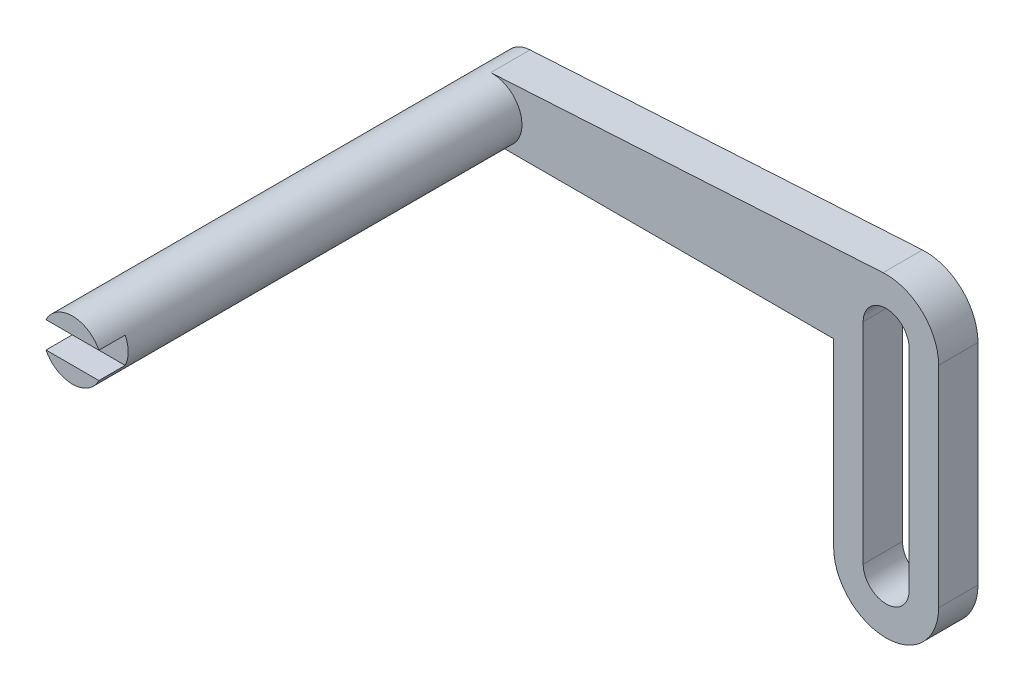
ISO-10303-21;
HEADER;
FILE_DESCRIPTION(('STEP AP214'),'2;1');
FILE_NAME('part.step','',(''),(''),'','','');
FILE_SCHEMA(('AUTOMOTIVE_DESIGN { 1 0 10303 214 1 1 1 1 }'));
ENDSEC;
DATA;
#1=APPLICATION_CONTEXT('core data for automotive mechanical design processes');
#2=APPLICATION_PROTOCOL_DEFINITION('international standard','automotive_design',2000,#1);
#3=PRODUCT_CONTEXT('',#1,'mechanical');
#4=PRODUCT('Part','Part','',(#3));
#5=PRODUCT_RELATED_PRODUCT_CATEGORY('part','',(#4));
#6=PRODUCT_DEFINITION_FORMATION('','',#4);
#7=PRODUCT_DEFINITION_CONTEXT('part definition',#1,'design');
#8=PRODUCT_DEFINITION('design','',#6,#7);
#9=PRODUCT_DEFINITION_SHAPE('','',#8);
#10=(LENGTH_UNIT() NAMED_UNIT(*) SI_UNIT(.MILLI.,.METRE.));
#11=(NAMED_UNIT(*) PLANE_ANGLE_UNIT() SI_UNIT($,.RADIAN.));
#12=(NAMED_UNIT(*) SI_UNIT($,.STERADIAN.) SOLID_ANGLE_UNIT());
#13=UNCERTAINTY_MEASURE_WITH_UNIT(LENGTH_MEASURE(1.E-05),#10,'distance_accuracy_value','');
#14=(GEOMETRIC_REPRESENTATION_CONTEXT(3) GLOBAL_UNCERTAINTY_ASSIGNED_CONTEXT((#13)) GLOBAL_UNIT_ASSIGNED_CONTEXT((#10,
#11,#12)) REPRESENTATION_CONTEXT('',''));
#15=CARTESIAN_POINT('',(0.,0.,0.));
#16=DIRECTION('',(0.,0.,1.));
#17=DIRECTION('',(1.,0.,0.));
#18=AXIS2_PLACEMENT_3D('',#15,#16,#17);
#19=CARTESIAN_POINT('',(0.,0.,35.));
#20=DIRECTION('',(0.,0.,1.));
#21=DIRECTION('',(1.,0.,0.));
#22=AXIS2_PLACEMENT_3D('',#19,#20,#21);
#23=PLANE('',#22);
#24=DIRECTION('',(-1.,0.,0.));
#25=VECTOR('',#24,1.);
#26=CARTESIAN_POINT('',(0.,1.,35.));
#27=LINE('',#26,#25);
#28=CARTESIAN_POINT('',(2.01556443707464,1.,35.));
#29=VERTEX_POINT('',#28);
#30=CARTESIAN_POINT('',(-2.01556443707464,1.,35.));
#31=VERTEX_POINT('',#30);
#32=EDGE_CURVE('E162',#29,#31,#27,.T.);
#33=ORIENTED_EDGE('',*,*,#32,.F.);
#34=CARTESIAN_POINT('',(0.,0.,35.));
#35=DIRECTION('',(0.,0.,1.));
#36=DIRECTION('',(1.,0.,0.));
#37=AXIS2_PLACEMENT_3D('',#34,#35,#36);
#38=CIRCLE('',#37,2.25);
#39=EDGE_CURVE('E176',#29,#31,#38,.T.);
#40=ORIENTED_EDGE('',*,*,#39,.T.);
#41=EDGE_LOOP('',(#33,#40));
#42=FACE_BOUND('',#41,.T.);
#43=ADVANCED_FACE('F41',(#42),#23,.T.);
#44=CARTESIAN_POINT('',(0.,0.,3.));
#45=DIRECTION('',(0.,0.,-1.));
#46=DIRECTION('',(-1.,0.,0.));
#47=AXIS2_PLACEMENT_3D('',#44,#45,#46);
#48=CYLINDRICAL_SURFACE('',#47,2.25);
#49=ORIENTED_EDGE('',*,*,#39,.F.);
#50=DIRECTION('',(0.,0.,-1.));
#51=VECTOR('',#50,1.);
#52=CARTESIAN_POINT('',(2.01556443707464,1.,3.));
#53=LINE('',#52,#51);
#54=CARTESIAN_POINT('',(2.01556443707464,1.,33.));
#55=VERTEX_POINT('',#54);
#56=EDGE_CURVE('E177',#29,#55,#53,.T.);
#57=ORIENTED_EDGE('',*,*,#56,.T.);
#58=CARTESIAN_POINT('',(0.,0.,33.));
#59=DIRECTION('',(0.,0.,-1.));
#60=DIRECTION('',(-1.,0.,0.));
#61=AXIS2_PLACEMENT_3D('',#58,#59,#60);
#62=CIRCLE('',#61,2.25);
#63=CARTESIAN_POINT('',(2.01556443707464,-1.,33.));
#64=VERTEX_POINT('',#63);
#65=EDGE_CURVE('E172',#55,#64,#62,.T.);
#66=ORIENTED_EDGE('',*,*,#65,.T.);
#67=DIRECTION('',(0.,0.,-1.));
#68=VECTOR('',#67,1.);
#69=CARTESIAN_POINT('',(2.01556443707464,-1.,3.));
#70=LINE('',#69,#68);
#71=CARTESIAN_POINT('',(2.01556443707464,-1.,35.));
#72=VERTEX_POINT('',#71);
#73=EDGE_CURVE('E155',#64,#72,#70,.F.);
#74=ORIENTED_EDGE('',*,*,#73,.T.);
#75=CARTESIAN_POINT('',(-2.01556443707464,-1.,35.));
#76=VERTEX_POINT('',#75);
#77=EDGE_CURVE('E170',#76,#72,#38,.T.);
#78=ORIENTED_EDGE('',*,*,#77,.F.);
#79=DIRECTION('',(0.,0.,-1.));
#80=VECTOR('',#79,1.);
#81=CARTESIAN_POINT('',(-2.01556443707464,-1.,3.));
#82=LINE('',#81,#80);
#83=CARTESIAN_POINT('',(-2.01556443707464,-1.,33.));
#84=VERTEX_POINT('',#83);
#85=EDGE_CURVE('E158',#76,#84,#82,.T.);
#86=ORIENTED_EDGE('',*,*,#85,.T.);
#87=CARTESIAN_POINT('',(-2.01556443707464,1.,33.));
#88=VERTEX_POINT('',#87);
#89=EDGE_CURVE('E259',#84,#88,#62,.T.);
#90=ORIENTED_EDGE('',*,*,#89,.T.);
#91=DIRECTION('',(0.,0.,-1.));
#92=VECTOR('',#91,1.);
#93=CARTESIAN_POINT('',(-2.01556443707464,1.,3.));
#94=LINE('',#93,#92);
#95=EDGE_CURVE('E181',#88,#31,#94,.F.);
#96=ORIENTED_EDGE('',*,*,#95,.T.);
#97=EDGE_LOOP('',(#49,#57,#66,#74,#78,#86,#90,#96));
#98=FACE_BOUND('',#97,.T.);
#99=CARTESIAN_POINT('',(0.,0.,0.));
#100=DIRECTION('',(0.,0.,1.));
#101=DIRECTION('',(1.,0.,0.));
#102=AXIS2_PLACEMENT_3D('',#99,#100,#101);
#103=CIRCLE('',#102,2.25);
#104=CARTESIAN_POINT('',(-0.13125,2.24616861288283,0.));
#105=VERTEX_POINT('',#104);
#106=CARTESIAN_POINT('',(0.,-2.25,0.));
#107=VERTEX_POINT('',#106);
#108=EDGE_CURVE('E224',#105,#107,#103,.T.);
#109=ORIENTED_EDGE('',*,*,#108,.T.);
#110=DIRECTION('',(0.,0.,-1.));
#111=VECTOR('',#110,1.);
#112=CARTESIAN_POINT('',(0.,-2.25,3.));
#113=LINE('',#112,#111);
#114=CARTESIAN_POINT('',(0.,-2.25,3.));
#115=VERTEX_POINT('',#114);
#116=EDGE_CURVE('E163',#115,#107,#113,.T.);
#117=ORIENTED_EDGE('',*,*,#116,.F.);
#118=CARTESIAN_POINT('',(0.,0.,3.));
#119=DIRECTION('',(0.,0.,1.));
#120=DIRECTION('',(1.,0.,0.));
#121=AXIS2_PLACEMENT_3D('',#118,#119,#120);
#122=CIRCLE('',#121,2.25);
#123=CARTESIAN_POINT('',(-0.13125,2.24616861288284,3.));
#124=VERTEX_POINT('',#123);
#125=EDGE_CURVE('E180',#124,#115,#122,.F.);
#126=ORIENTED_EDGE('',*,*,#125,.F.);
#127=DIRECTION('',(0.,0.,-1.));
#128=VECTOR('',#127,1.);
#129=CARTESIAN_POINT('',(-0.13125,2.24616861288283,3.));
#130=LINE('',#129,#128);
#131=EDGE_CURVE('E240',#124,#105,#130,.T.);
#132=ORIENTED_EDGE('',*,*,#131,.T.);
#133=EDGE_LOOP('',(#109,#117,#126,#132));
#134=FACE_BOUND('',#133,.T.);
#135=ADVANCED_FACE('F168',(#98,#134),#48,.T.);
#136=CARTESIAN_POINT('',(0.,-2.25,3.));
#137=DIRECTION('',(0.,1.,0.));
#138=DIRECTION('',(-1.,0.,0.));
#139=AXIS2_PLACEMENT_3D('',#136,#137,#138);
#140=PLANE('',#139);
#141=DIRECTION('',(1.,0.,0.));
#142=VECTOR('',#141,1.);
#143=CARTESIAN_POINT('',(0.,-2.25,0.));
#144=LINE('',#143,#142);
#145=CARTESIAN_POINT('',(26.,-2.25,0.));
#146=VERTEX_POINT('',#145);
#147=EDGE_CURVE('E227',#107,#146,#144,.T.);
#148=ORIENTED_EDGE('',*,*,#147,.T.);
#149=DIRECTION('',(0.,0.,-1.));
#150=VECTOR('',#149,1.);
#151=CARTESIAN_POINT('',(26.,-2.25,3.));
#152=LINE('',#151,#150);
#153=CARTESIAN_POINT('',(26.,-2.25,3.));
#154=VERTEX_POINT('',#153);
#155=EDGE_CURVE('E247',#154,#146,#152,.T.);
#156=ORIENTED_EDGE('',*,*,#155,.F.);
#157=DIRECTION('',(1.,0.,0.));
#158=VECTOR('',#157,1.);
#159=CARTESIAN_POINT('',(0.,-2.25,3.));
#160=LINE('',#159,#158);
#161=EDGE_CURVE('E200',#115,#154,#160,.T.);
#162=ORIENTED_EDGE('',*,*,#161,.F.);
#163=ORIENTED_EDGE('',*,*,#116,.T.);
#164=EDGE_LOOP('',(#148,#156,#162,#163));
#165=FACE_BOUND('',#164,.T.);
#166=ADVANCED_FACE('F282',(#165),#140,.F.);
#167=CARTESIAN_POINT('',(26.,0.,3.));
#168=DIRECTION('',(-1.,0.,0.));
#169=DIRECTION('',(0.,0.,1.));
#170=AXIS2_PLACEMENT_3D('',#167,#168,#169);
#171=PLANE('',#170);
#172=DIRECTION('',(0.,1.,0.));
#173=VECTOR('',#172,1.);
#174=CARTESIAN_POINT('',(26.,0.,0.));
#175=LINE('',#174,#173);
#176=CARTESIAN_POINT('',(26.,-16.,0.));
#177=VERTEX_POINT('',#176);
#178=EDGE_CURVE('E230',#177,#146,#175,.T.);
#179=ORIENTED_EDGE('',*,*,#178,.F.);
#180=DIRECTION('',(0.,0.,-1.));
#181=VECTOR('',#180,1.);
#182=CARTESIAN_POINT('',(26.,-16.,3.));
#183=LINE('',#182,#181);
#184=CARTESIAN_POINT('',(26.,-16.,3.));
#185=VERTEX_POINT('',#184);
#186=EDGE_CURVE('E266',#177,#185,#183,.F.);
#187=ORIENTED_EDGE('',*,*,#186,.T.);
#188=DIRECTION('',(0.,1.,0.));
#189=VECTOR('',#188,1.);
#190=CARTESIAN_POINT('',(26.,0.,3.));
#191=LINE('',#190,#189);
#192=EDGE_CURVE('E203',#185,#154,#191,.T.);
#193=ORIENTED_EDGE('',*,*,#192,.T.);
#194=ORIENTED_EDGE('',*,*,#155,.T.);
#195=EDGE_LOOP('',(#179,#187,#193,#194));
#196=FACE_BOUND('',#195,.T.);
#197=ADVANCED_FACE('F273',(#196),#171,.T.);
#198=CARTESIAN_POINT('',(34.,0.,3.));
#199=DIRECTION('',(1.,0.,0.));
#200=DIRECTION('',(0.,1.,0.));
#201=AXIS2_PLACEMENT_3D('',#198,#199,#200);
#202=PLANE('',#201);
#203=DIRECTION('',(0.,-1.,0.));
#204=VECTOR('',#203,1.);
#205=CARTESIAN_POINT('',(34.,0.,3.));
#206=LINE('',#205,#204);
#207=CARTESIAN_POINT('',(34.,0.,3.));
#208=VERTEX_POINT('',#207);
#209=CARTESIAN_POINT('',(34.,-16.,3.));
#210=VERTEX_POINT('',#209);
#211=EDGE_CURVE('E205',#208,#210,#206,.T.);
#212=ORIENTED_EDGE('',*,*,#211,.T.);
#213=DIRECTION('',(0.,0.,-1.));
#214=VECTOR('',#213,1.);
#215=CARTESIAN_POINT('',(34.,-16.,3.));
#216=LINE('',#215,#214);
#217=CARTESIAN_POINT('',(34.,-16.,0.));
#218=VERTEX_POINT('',#217);
#219=EDGE_CURVE('E11',#210,#218,#216,.T.);
#220=ORIENTED_EDGE('',*,*,#219,.T.);
#221=DIRECTION('',(0.,-1.,0.));
#222=VECTOR('',#221,1.);
#223=CARTESIAN_POINT('',(34.,0.,0.));
#224=LINE('',#223,#222);
#225=CARTESIAN_POINT('',(34.,0.,0.));
#226=VERTEX_POINT('',#225);
#227=EDGE_CURVE('E232',#226,#218,#224,.T.);
#228=ORIENTED_EDGE('',*,*,#227,.F.);
#229=DIRECTION('',(0.,0.,-1.));
#230=VECTOR('',#229,1.);
#231=CARTESIAN_POINT('',(34.,0.,3.));
#232=LINE('',#231,#230);
#233=EDGE_CURVE('E245',#208,#226,#232,.T.);
#234=ORIENTED_EDGE('',*,*,#233,.F.);
#235=EDGE_LOOP('',(#212,#220,#228,#234));
#236=FACE_BOUND('',#235,.T.);
#237=ADVANCED_FACE('F335',(#236),#202,.T.);
#238=CARTESIAN_POINT('',(30.,0.,3.));
#239=DIRECTION('',(0.,0.,-1.));
#240=DIRECTION('',(-1.,0.,0.));
#241=AXIS2_PLACEMENT_3D('',#238,#239,#240);
#242=CYLINDRICAL_SURFACE('',#241,4.);
#243=CARTESIAN_POINT('',(30.,0.,0.));
#244=DIRECTION('',(0.,0.,1.));
#245=DIRECTION('',(1.,0.,0.));
#246=AXIS2_PLACEMENT_3D('',#243,#244,#245);
#247=CIRCLE('',#246,4.);
#248=CARTESIAN_POINT('',(29.7666666666667,3.99318864512504,0.));
#249=VERTEX_POINT('',#248);
#250=EDGE_CURVE('E235',#226,#249,#247,.T.);
#251=ORIENTED_EDGE('',*,*,#250,.T.);
#252=DIRECTION('',(0.,0.,-1.));
#253=VECTOR('',#252,1.);
#254=CARTESIAN_POINT('',(29.7666666666667,3.99318864512504,3.));
#255=LINE('',#254,#253);
#256=CARTESIAN_POINT('',(29.7666666666667,3.99318864512504,3.));
#257=VERTEX_POINT('',#256);
#258=EDGE_CURVE('E242',#257,#249,#255,.T.);
#259=ORIENTED_EDGE('',*,*,#258,.F.);
#260=CARTESIAN_POINT('',(30.,0.,3.));
#261=DIRECTION('',(0.,0.,1.));
#262=DIRECTION('',(1.,0.,0.));
#263=AXIS2_PLACEMENT_3D('',#260,#261,#262);
#264=CIRCLE('',#263,4.);
#265=EDGE_CURVE('E207',#208,#257,#264,.T.);
#266=ORIENTED_EDGE('',*,*,#265,.F.);
#267=ORIENTED_EDGE('',*,*,#233,.T.);
#268=EDGE_LOOP('',(#251,#259,#266,#267));
#269=FACE_BOUND('',#268,.T.);
#270=ADVANCED_FACE('F331',(#269),#242,.T.);
#271=CARTESIAN_POINT('',(28.25,0.,3.));
#272=DIRECTION('',(1.,0.,0.));
#273=DIRECTION('',(0.,1.,0.));
#274=AXIS2_PLACEMENT_3D('',#271,#272,#273);
#275=PLANE('',#274);
#276=DIRECTION('',(0.,-1.,0.));
#277=VECTOR('',#276,1.);
#278=CARTESIAN_POINT('',(28.25,0.,0.));
#279=LINE('',#278,#277);
#280=CARTESIAN_POINT('',(28.25,0.,0.));
#281=VERTEX_POINT('',#280);
#282=CARTESIAN_POINT('',(28.25,-16.,0.));
#283=VERTEX_POINT('',#282);
#284=EDGE_CURVE('E186',#281,#283,#279,.T.);
#285=ORIENTED_EDGE('',*,*,#284,.F.);
#286=DIRECTION('',(0.,0.,-1.));
#287=VECTOR('',#286,1.);
#288=CARTESIAN_POINT('',(28.25,0.,3.));
#289=LINE('',#288,#287);
#290=CARTESIAN_POINT('',(28.25,0.,3.));
#291=VERTEX_POINT('',#290);
#292=EDGE_CURVE('E243',#291,#281,#289,.T.);
#293=ORIENTED_EDGE('',*,*,#292,.F.);
#294=DIRECTION('',(0.,-1.,0.));
#295=VECTOR('',#294,1.);
#296=CARTESIAN_POINT('',(28.25,0.,3.));
#297=LINE('',#296,#295);
#298=CARTESIAN_POINT('',(28.25,-16.,3.));
#299=VERTEX_POINT('',#298);
#300=EDGE_CURVE('E187',#291,#299,#297,.T.);
#301=ORIENTED_EDGE('',*,*,#300,.T.);
#302=DIRECTION('',(0.,0.,-1.));
#303=VECTOR('',#302,1.);
#304=CARTESIAN_POINT('',(28.25,-16.,3.));
#305=LINE('',#304,#303);
#306=EDGE_CURVE('E212',#299,#283,#305,.T.);
#307=ORIENTED_EDGE('',*,*,#306,.T.);
#308=EDGE_LOOP('',(#285,#293,#301,#307));
#309=FACE_BOUND('',#308,.T.);
#310=ADVANCED_FACE('F334',(#309),#275,.T.);
#311=CARTESIAN_POINT('',(30.,0.,3.));
#312=DIRECTION('',(0.,0.,-1.));
#313=DIRECTION('',(-1.,0.,0.));
#314=AXIS2_PLACEMENT_3D('',#311,#312,#313);
#315=CYLINDRICAL_SURFACE('',#314,1.75);
#316=CARTESIAN_POINT('',(30.,0.,0.));
#317=DIRECTION('',(0.,0.,1.));
#318=DIRECTION('',(1.,0.,0.));
#319=AXIS2_PLACEMENT_3D('',#316,#317,#318);
#320=CIRCLE('',#319,1.75);
#321=CARTESIAN_POINT('',(31.75,0.,0.));
#322=VERTEX_POINT('',#321);
#323=EDGE_CURVE('E215',#322,#281,#320,.T.);
#324=ORIENTED_EDGE('',*,*,#323,.F.);
#325=DIRECTION('',(0.,0.,-1.));
#326=VECTOR('',#325,1.);
#327=CARTESIAN_POINT('',(31.75,0.,3.));
#328=LINE('',#327,#326);
#329=CARTESIAN_POINT('',(31.75,0.,3.));
#330=VERTEX_POINT('',#329);
#331=EDGE_CURVE('E255',#330,#322,#328,.T.);
#332=ORIENTED_EDGE('',*,*,#331,.F.);
#333=CARTESIAN_POINT('',(30.,0.,3.));
#334=DIRECTION('',(0.,0.,1.));
#335=DIRECTION('',(1.,0.,0.));
#336=AXIS2_PLACEMENT_3D('',#333,#334,#335);
#337=CIRCLE('',#336,1.75);
#338=EDGE_CURVE('E190',#330,#291,#337,.T.);
#339=ORIENTED_EDGE('',*,*,#338,.T.);
#340=ORIENTED_EDGE('',*,*,#292,.T.);
#341=EDGE_LOOP('',(#324,#332,#339,#340));
#342=FACE_BOUND('',#341,.T.);
#343=ADVANCED_FACE('F350',(#342),#315,.F.);
#344=CARTESIAN_POINT('',(31.75,0.,3.));
#345=DIRECTION('',(-1.,0.,0.));
#346=DIRECTION('',(0.,0.,1.));
#347=AXIS2_PLACEMENT_3D('',#344,#345,#346);
#348=PLANE('',#347);
#349=DIRECTION('',(0.,1.,0.));
#350=VECTOR('',#349,1.);
#351=CARTESIAN_POINT('',(31.75,0.,0.));
#352=LINE('',#351,#350);
#353=CARTESIAN_POINT('',(31.75,-16.,0.));
#354=VERTEX_POINT('',#353);
#355=EDGE_CURVE('E218',#354,#322,#352,.T.);
#356=ORIENTED_EDGE('',*,*,#355,.F.);
#357=DIRECTION('',(0.,0.,-1.));
#358=VECTOR('',#357,1.);
#359=CARTESIAN_POINT('',(31.75,-16.,3.));
#360=LINE('',#359,#358);
#361=CARTESIAN_POINT('',(31.75,-16.,3.));
#362=VERTEX_POINT('',#361);
#363=EDGE_CURVE('E253',#362,#354,#360,.T.);
#364=ORIENTED_EDGE('',*,*,#363,.F.);
#365=DIRECTION('',(0.,1.,0.));
#366=VECTOR('',#365,1.);
#367=CARTESIAN_POINT('',(31.75,0.,3.));
#368=LINE('',#367,#366);
#369=EDGE_CURVE('E194',#362,#330,#368,.T.);
#370=ORIENTED_EDGE('',*,*,#369,.T.);
#371=ORIENTED_EDGE('',*,*,#331,.T.);
#372=EDGE_LOOP('',(#356,#364,#370,#371));
#373=FACE_BOUND('',#372,.T.);
#374=ADVANCED_FACE('F346',(#373),#348,.T.);
#375=CARTESIAN_POINT('',(30.,-16.,3.));
#376=DIRECTION('',(0.,0.,-1.));
#377=DIRECTION('',(-1.,0.,0.));
#378=AXIS2_PLACEMENT_3D('',#375,#376,#377);
#379=CYLINDRICAL_SURFACE('',#378,1.75000000000001);
#380=CARTESIAN_POINT('',(30.,-16.,0.));
#381=DIRECTION('',(0.,0.,1.));
#382=DIRECTION('',(1.,0.,0.));
#383=AXIS2_PLACEMENT_3D('',#380,#381,#382);
#384=CIRCLE('',#383,1.75000000000001);
#385=EDGE_CURVE('E221',#283,#354,#384,.T.);
#386=ORIENTED_EDGE('',*,*,#385,.F.);
#387=ORIENTED_EDGE('',*,*,#306,.F.);
#388=CARTESIAN_POINT('',(30.,-16.,3.));
#389=DIRECTION('',(0.,0.,1.));
#390=DIRECTION('',(1.,0.,0.));
#391=AXIS2_PLACEMENT_3D('',#388,#389,#390);
#392=CIRCLE('',#391,1.75000000000001);
#393=EDGE_CURVE('E197',#299,#362,#392,.T.);
#394=ORIENTED_EDGE('',*,*,#393,.T.);
#395=ORIENTED_EDGE('',*,*,#363,.T.);
#396=EDGE_LOOP('',(#386,#387,#394,#395));
#397=FACE_BOUND('',#396,.T.);
#398=ADVANCED_FACE('F329',(#397),#379,.F.);
#399=CARTESIAN_POINT('',(-0.13125,2.24616861288284,3.));
#400=DIRECTION('',(-0.0583333333333333,0.99829716128126,0.));
#401=DIRECTION('',(-0.99829716128126,-0.0583333333333333,0.));
#402=AXIS2_PLACEMENT_3D('',#399,#400,#401);
#403=PLANE('',#402);
#404=DIRECTION('',(0.99829716128126,0.0583333333333333,0.));
#405=VECTOR('',#404,1.);
#406=CARTESIAN_POINT('',(-0.13125,2.24616861288284,0.));
#407=LINE('',#406,#405);
#408=EDGE_CURVE('E191',#105,#249,#407,.T.);
#409=ORIENTED_EDGE('',*,*,#408,.F.);
#410=ORIENTED_EDGE('',*,*,#131,.F.);
#411=DIRECTION('',(0.99829716128126,0.0583333333333333,0.));
#412=VECTOR('',#411,1.);
#413=CARTESIAN_POINT('',(-0.13125,2.24616861288284,3.));
#414=LINE('',#413,#412);
#415=EDGE_CURVE('E209',#124,#257,#414,.T.);
#416=ORIENTED_EDGE('',*,*,#415,.T.);
#417=ORIENTED_EDGE('',*,*,#258,.T.);
#418=EDGE_LOOP('',(#409,#410,#416,#417));
#419=FACE_BOUND('',#418,.T.);
#420=ADVANCED_FACE('F323',(#419),#403,.T.);
#421=CARTESIAN_POINT('',(0.,0.,3.));
#422=DIRECTION('',(0.,0.,1.));
#423=DIRECTION('',(1.,0.,0.));
#424=AXIS2_PLACEMENT_3D('',#421,#422,#423);
#425=PLANE('',#424);
#426=ORIENTED_EDGE('',*,*,#300,.F.);
#427=ORIENTED_EDGE('',*,*,#338,.F.);
#428=ORIENTED_EDGE('',*,*,#369,.F.);
#429=ORIENTED_EDGE('',*,*,#393,.F.);
#430=EDGE_LOOP('',(#426,#427,#428,#429));
#431=FACE_BOUND('',#430,.T.);
#432=ORIENTED_EDGE('',*,*,#192,.F.);
#433=CARTESIAN_POINT('',(30.,-16.,3.));
#434=DIRECTION('',(0.,0.,1.));
#435=DIRECTION('',(1.,0.,0.));
#436=AXIS2_PLACEMENT_3D('',#433,#434,#435);
#437=CIRCLE('',#436,4.);
#438=CARTESIAN_POINT('',(30.,-20.,3.));
#439=VERTEX_POINT('',#438);
#440=EDGE_CURVE('E50',#185,#439,#437,.T.);
#441=ORIENTED_EDGE('',*,*,#440,.T.);
#442=CARTESIAN_POINT('',(30.,-16.,3.));
#443=DIRECTION('',(0.,0.,1.));
#444=DIRECTION('',(1.,0.,0.));
#445=AXIS2_PLACEMENT_3D('',#442,#443,#444);
#446=CIRCLE('',#445,4.);
#447=EDGE_CURVE('E57',#439,#210,#446,.T.);
#448=ORIENTED_EDGE('',*,*,#447,.T.);
#449=ORIENTED_EDGE('',*,*,#211,.F.);
#450=ORIENTED_EDGE('',*,*,#265,.T.);
#451=ORIENTED_EDGE('',*,*,#415,.F.);
#452=ORIENTED_EDGE('',*,*,#125,.T.);
#453=ORIENTED_EDGE('',*,*,#161,.T.);
#454=EDGE_LOOP('',(#432,#441,#448,#449,#450,#451,#452,#453));
#455=FACE_BOUND('',#454,.T.);
#456=ADVANCED_FACE('F276',(#431,#455),#425,.T.);
#457=CARTESIAN_POINT('',(0.,0.,0.));
#458=DIRECTION('',(0.,0.,1.));
#459=DIRECTION('',(1.,0.,0.));
#460=AXIS2_PLACEMENT_3D('',#457,#458,#459);
#461=PLANE('',#460);
#462=CARTESIAN_POINT('',(30.,-16.,0.));
#463=DIRECTION('',(0.,0.,1.));
#464=DIRECTION('',(1.,0.,0.));
#465=AXIS2_PLACEMENT_3D('',#462,#463,#464);
#466=CIRCLE('',#465,4.);
#467=CARTESIAN_POINT('',(30.,-20.,0.));
#468=VERTEX_POINT('',#467);
#469=EDGE_CURVE('E262',#218,#468,#466,.F.);
#470=ORIENTED_EDGE('',*,*,#469,.T.);
#471=CARTESIAN_POINT('',(30.,-16.,0.));
#472=DIRECTION('',(0.,0.,1.));
#473=DIRECTION('',(1.,0.,0.));
#474=AXIS2_PLACEMENT_3D('',#471,#472,#473);
#475=CIRCLE('',#474,4.);
#476=EDGE_CURVE('E264',#468,#177,#475,.F.);
#477=ORIENTED_EDGE('',*,*,#476,.T.);
#478=ORIENTED_EDGE('',*,*,#178,.T.);
#479=ORIENTED_EDGE('',*,*,#147,.F.);
#480=ORIENTED_EDGE('',*,*,#108,.F.);
#481=ORIENTED_EDGE('',*,*,#408,.T.);
#482=ORIENTED_EDGE('',*,*,#250,.F.);
#483=ORIENTED_EDGE('',*,*,#227,.T.);
#484=EDGE_LOOP('',(#470,#477,#478,#479,#480,#481,#482,#483));
#485=FACE_BOUND('',#484,.T.);
#486=ORIENTED_EDGE('',*,*,#284,.T.);
#487=ORIENTED_EDGE('',*,*,#385,.T.);
#488=ORIENTED_EDGE('',*,*,#355,.T.);
#489=ORIENTED_EDGE('',*,*,#323,.T.);
#490=EDGE_LOOP('',(#486,#487,#488,#489));
#491=FACE_BOUND('',#490,.T.);
#492=ADVANCED_FACE('F285',(#485,#491),#461,.F.);
#493=DIRECTION('',(1.,0.,0.));
#494=VECTOR('',#493,1.);
#495=CARTESIAN_POINT('',(0.,-1.,35.));
#496=LINE('',#495,#494);
#497=EDGE_CURVE('E151',#76,#72,#496,.T.);
#498=ORIENTED_EDGE('',*,*,#497,.F.);
#499=ORIENTED_EDGE('',*,*,#77,.T.);
#500=EDGE_LOOP('',(#498,#499));
#501=FACE_BOUND('',#500,.T.);
#502=ADVANCED_FACE('F175',(#501),#23,.T.);
#503=CARTESIAN_POINT('',(0.,0.,33.));
#504=DIRECTION('',(0.,0.,-1.));
#505=DIRECTION('',(-1.,0.,0.));
#506=AXIS2_PLACEMENT_3D('',#503,#504,#505);
#507=PLANE('',#506);
#508=DIRECTION('',(-1.,0.,0.));
#509=VECTOR('',#508,1.);
#510=CARTESIAN_POINT('',(2.5,1.,33.));
#511=LINE('',#510,#509);
#512=EDGE_CURVE('E173',#55,#88,#511,.T.);
#513=ORIENTED_EDGE('',*,*,#512,.T.);
#514=ORIENTED_EDGE('',*,*,#89,.F.);
#515=DIRECTION('',(1.,0.,0.));
#516=VECTOR('',#515,1.);
#517=CARTESIAN_POINT('',(2.5,-1.,33.));
#518=LINE('',#517,#516);
#519=EDGE_CURVE('E293',#84,#64,#518,.T.);
#520=ORIENTED_EDGE('',*,*,#519,.T.);
#521=ORIENTED_EDGE('',*,*,#65,.F.);
#522=EDGE_LOOP('',(#513,#514,#520,#521));
#523=FACE_BOUND('',#522,.T.);
#524=ADVANCED_FACE('F305',(#523),#507,.F.);
#525=CARTESIAN_POINT('',(2.5,1.,33.));
#526=DIRECTION('',(0.,1.,0.));
#527=DIRECTION('',(-1.,0.,0.));
#528=AXIS2_PLACEMENT_3D('',#525,#526,#527);
#529=PLANE('',#528);
#530=ORIENTED_EDGE('',*,*,#32,.T.);
#531=ORIENTED_EDGE('',*,*,#95,.F.);
#532=ORIENTED_EDGE('',*,*,#512,.F.);
#533=ORIENTED_EDGE('',*,*,#56,.F.);
#534=EDGE_LOOP('',(#530,#531,#532,#533));
#535=FACE_BOUND('',#534,.T.);
#536=ADVANCED_FACE('F304',(#535),#529,.F.);
#537=CARTESIAN_POINT('',(2.5,-1.,33.));
#538=DIRECTION('',(0.,-1.,0.));
#539=DIRECTION('',(1.,0.,0.));
#540=AXIS2_PLACEMENT_3D('',#537,#538,#539);
#541=PLANE('',#540);
#542=ORIENTED_EDGE('',*,*,#497,.T.);
#543=ORIENTED_EDGE('',*,*,#73,.F.);
#544=ORIENTED_EDGE('',*,*,#519,.F.);
#545=ORIENTED_EDGE('',*,*,#85,.F.);
#546=EDGE_LOOP('',(#542,#543,#544,#545));
#547=FACE_BOUND('',#546,.T.);
#548=ADVANCED_FACE('F153',(#547),#541,.F.);
#549=CARTESIAN_POINT('',(30.,-16.,3.));
#550=DIRECTION('',(0.,0.,-1.));
#551=DIRECTION('',(-1.,0.,0.));
#552=AXIS2_PLACEMENT_3D('',#549,#550,#551);
#553=CYLINDRICAL_SURFACE('',#552,4.);
#554=ORIENTED_EDGE('',*,*,#219,.F.);
#555=ORIENTED_EDGE('',*,*,#447,.F.);
#556=DIRECTION('',(0.,0.,-1.));
#557=VECTOR('',#556,1.);
#558=CARTESIAN_POINT('',(30.,-20.,3.));
#559=LINE('',#558,#557);
#560=EDGE_CURVE('E45',#468,#439,#559,.F.);
#561=ORIENTED_EDGE('',*,*,#560,.F.);
#562=ORIENTED_EDGE('',*,*,#469,.F.);
#563=EDGE_LOOP('',(#554,#555,#561,#562));
#564=FACE_BOUND('',#563,.T.);
#565=ADVANCED_FACE('F43',(#564),#553,.T.);
#566=CARTESIAN_POINT('',(30.,-16.,3.));
#567=DIRECTION('',(0.,0.,-1.));
#568=DIRECTION('',(-1.,0.,0.));
#569=AXIS2_PLACEMENT_3D('',#566,#567,#568);
#570=CYLINDRICAL_SURFACE('',#569,4.);
#571=ORIENTED_EDGE('',*,*,#440,.F.);
#572=ORIENTED_EDGE('',*,*,#186,.F.);
#573=ORIENTED_EDGE('',*,*,#476,.F.);
#574=ORIENTED_EDGE('',*,*,#560,.T.);
#575=EDGE_LOOP('',(#571,#572,#573,#574));
#576=FACE_BOUND('',#575,.T.);
#577=ADVANCED_FACE('F291',(#576),#570,.T.);
#578=CLOSED_SHELL('',(#43,#135,#166,#197,#237,#270,#310,#343,#374,#398,#420,#456,#492,#502,#524,
#536,#548,#565,#577));
#579=MANIFOLD_SOLID_BREP('B2',#578);
#580=ADVANCED_BREP_SHAPE_REPRESENTATION('',(#18,#579),#14);
#581=SHAPE_DEFINITION_REPRESENTATION(#9,#580);
ENDSEC;
END-ISO-10303-21;
